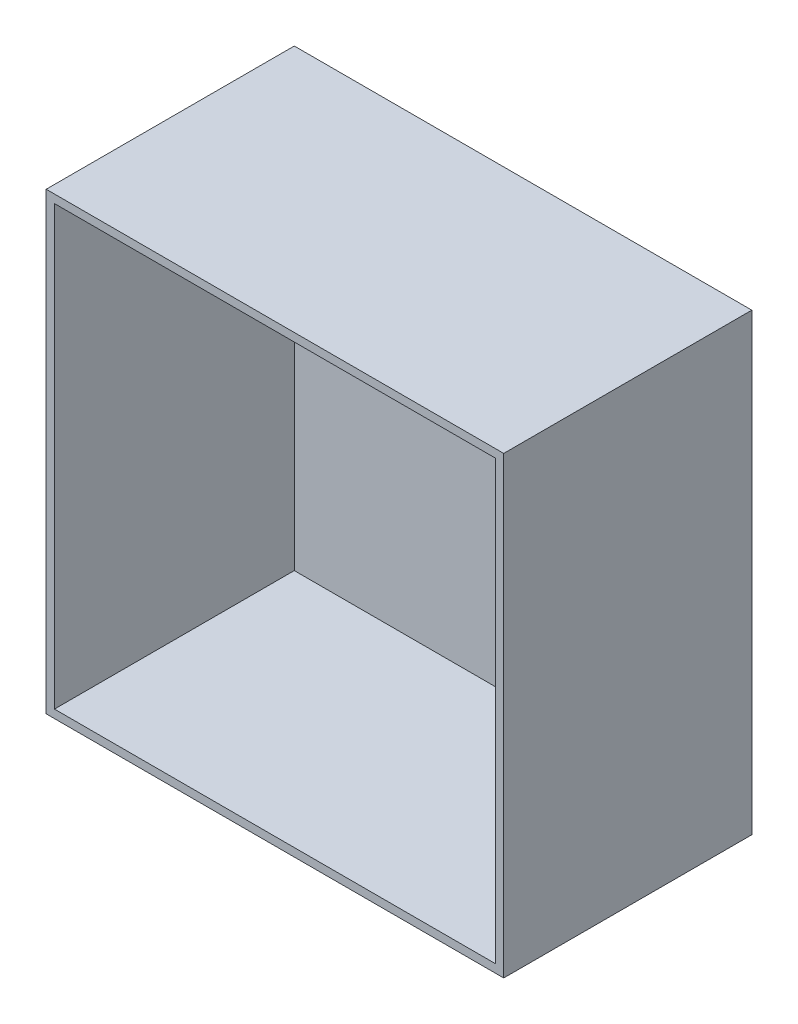
ISO-10303-21;
HEADER;
FILE_DESCRIPTION(('STEP AP214'),'2;1');
FILE_NAME('part.step','',(''),(''),'','','');
FILE_SCHEMA(('AUTOMOTIVE_DESIGN { 1 0 10303 214 1 1 1 1 }'));
ENDSEC;
DATA;
#1=APPLICATION_CONTEXT('core data for automotive mechanical design processes');
#2=APPLICATION_PROTOCOL_DEFINITION('international standard','automotive_design',2000,#1);
#3=PRODUCT_CONTEXT('',#1,'mechanical');
#4=PRODUCT('Part','Part','',(#3));
#5=PRODUCT_RELATED_PRODUCT_CATEGORY('part','',(#4));
#6=PRODUCT_DEFINITION_FORMATION('','',#4);
#7=PRODUCT_DEFINITION_CONTEXT('part definition',#1,'design');
#8=PRODUCT_DEFINITION('design','',#6,#7);
#9=PRODUCT_DEFINITION_SHAPE('','',#8);
#10=(LENGTH_UNIT() NAMED_UNIT(*) SI_UNIT(.MILLI.,.METRE.));
#11=(NAMED_UNIT(*) PLANE_ANGLE_UNIT() SI_UNIT($,.RADIAN.));
#12=(NAMED_UNIT(*) SI_UNIT($,.STERADIAN.) SOLID_ANGLE_UNIT());
#13=UNCERTAINTY_MEASURE_WITH_UNIT(LENGTH_MEASURE(1.E-05),#10,'distance_accuracy_value','');
#14=(GEOMETRIC_REPRESENTATION_CONTEXT(3) GLOBAL_UNCERTAINTY_ASSIGNED_CONTEXT((#13)) GLOBAL_UNIT_ASSIGNED_CONTEXT((#10,
#11,#12)) REPRESENTATION_CONTEXT('',''));
#15=CARTESIAN_POINT('',(0.,0.,0.));
#16=DIRECTION('',(0.,0.,1.));
#17=DIRECTION('',(1.,0.,0.));
#18=AXIS2_PLACEMENT_3D('',#15,#16,#17);
#19=CARTESIAN_POINT('',(0.,0.,60.1));
#20=DIRECTION('',(-1.,0.,0.));
#21=DIRECTION('',(0.,0.,1.));
#22=AXIS2_PLACEMENT_3D('',#19,#20,#21);
#23=PLANE('',#22);
#24=DIRECTION('',(0.,1.,0.));
#25=VECTOR('',#24,1.);
#26=CARTESIAN_POINT('',(0.,0.,0.));
#27=LINE('',#26,#25);
#28=CARTESIAN_POINT('',(0.,0.,0.));
#29=VERTEX_POINT('',#28);
#30=CARTESIAN_POINT('',(0.,110.06,0.));
#31=VERTEX_POINT('',#30);
#32=EDGE_CURVE('E141',#29,#31,#27,.T.);
#33=ORIENTED_EDGE('',*,*,#32,.T.);
#34=DIRECTION('',(0.,0.,-1.));
#35=VECTOR('',#34,1.);
#36=CARTESIAN_POINT('',(0.,110.06,60.1));
#37=LINE('',#36,#35);
#38=CARTESIAN_POINT('',(0.,110.06,60.1));
#39=VERTEX_POINT('',#38);
#40=EDGE_CURVE('E11',#39,#31,#37,.T.);
#41=ORIENTED_EDGE('',*,*,#40,.F.);
#42=DIRECTION('',(0.,1.,0.));
#43=VECTOR('',#42,1.);
#44=CARTESIAN_POINT('',(0.,0.,60.1));
#45=LINE('',#44,#43);
#46=CARTESIAN_POINT('',(0.,0.,60.1));
#47=VERTEX_POINT('',#46);
#48=EDGE_CURVE('E145',#47,#39,#45,.T.);
#49=ORIENTED_EDGE('',*,*,#48,.F.);
#50=DIRECTION('',(0.,0.,-1.));
#51=VECTOR('',#50,1.);
#52=CARTESIAN_POINT('',(0.,0.,60.1));
#53=LINE('',#52,#51);
#54=EDGE_CURVE('E151',#47,#29,#53,.T.);
#55=ORIENTED_EDGE('',*,*,#54,.T.);
#56=EDGE_LOOP('',(#33,#41,#49,#55));
#57=FACE_BOUND('',#56,.T.);
#58=ADVANCED_FACE('F33',(#57),#23,.F.);
#59=CARTESIAN_POINT('',(0.,110.06,60.1));
#60=DIRECTION('',(0.,-1.,0.));
#61=DIRECTION('',(1.,0.,0.));
#62=AXIS2_PLACEMENT_3D('',#59,#60,#61);
#63=PLANE('',#62);
#64=DIRECTION('',(-1.,0.,0.));
#65=VECTOR('',#64,1.);
#66=CARTESIAN_POINT('',(0.,110.06,0.));
#67=LINE('',#66,#65);
#68=CARTESIAN_POINT('',(-110.835,110.06,0.));
#69=VERTEX_POINT('',#68);
#70=EDGE_CURVE('E154',#31,#69,#67,.T.);
#71=ORIENTED_EDGE('',*,*,#70,.T.);
#72=DIRECTION('',(0.,0.,-1.));
#73=VECTOR('',#72,1.);
#74=CARTESIAN_POINT('',(-110.835,110.06,60.1));
#75=LINE('',#74,#73);
#76=CARTESIAN_POINT('',(-110.835,110.06,60.1));
#77=VERTEX_POINT('',#76);
#78=EDGE_CURVE('E40',#77,#69,#75,.T.);
#79=ORIENTED_EDGE('',*,*,#78,.F.);
#80=DIRECTION('',(-1.,0.,0.));
#81=VECTOR('',#80,1.);
#82=CARTESIAN_POINT('',(0.,110.06,60.1));
#83=LINE('',#82,#81);
#84=EDGE_CURVE('E84',#39,#77,#83,.T.);
#85=ORIENTED_EDGE('',*,*,#84,.F.);
#86=ORIENTED_EDGE('',*,*,#40,.T.);
#87=EDGE_LOOP('',(#71,#79,#85,#86));
#88=FACE_BOUND('',#87,.T.);
#89=ADVANCED_FACE('F183',(#88),#63,.F.);
#90=CARTESIAN_POINT('',(-110.835,0.,60.1));
#91=DIRECTION('',(1.,0.,0.));
#92=DIRECTION('',(0.,0.,-1.));
#93=AXIS2_PLACEMENT_3D('',#90,#91,#92);
#94=PLANE('',#93);
#95=DIRECTION('',(0.,-1.,0.));
#96=VECTOR('',#95,1.);
#97=CARTESIAN_POINT('',(-110.835,0.,0.));
#98=LINE('',#97,#96);
#99=CARTESIAN_POINT('',(-110.835,0.,0.));
#100=VERTEX_POINT('',#99);
#101=EDGE_CURVE('E156',#69,#100,#98,.T.);
#102=ORIENTED_EDGE('',*,*,#101,.T.);
#103=DIRECTION('',(0.,0.,-1.));
#104=VECTOR('',#103,1.);
#105=CARTESIAN_POINT('',(-110.835,0.,60.1));
#106=LINE('',#105,#104);
#107=CARTESIAN_POINT('',(-110.835,0.,60.1));
#108=VERTEX_POINT('',#107);
#109=EDGE_CURVE('E160',#108,#100,#106,.T.);
#110=ORIENTED_EDGE('',*,*,#109,.F.);
#111=DIRECTION('',(0.,-1.,0.));
#112=VECTOR('',#111,1.);
#113=CARTESIAN_POINT('',(-110.835,0.,60.1));
#114=LINE('',#113,#112);
#115=EDGE_CURVE('E148',#77,#108,#114,.T.);
#116=ORIENTED_EDGE('',*,*,#115,.F.);
#117=ORIENTED_EDGE('',*,*,#78,.T.);
#118=EDGE_LOOP('',(#102,#110,#116,#117));
#119=FACE_BOUND('',#118,.T.);
#120=ADVANCED_FACE('F165',(#119),#94,.F.);
#121=CARTESIAN_POINT('',(0.,0.,60.1));
#122=DIRECTION('',(0.,1.,0.));
#123=DIRECTION('',(-1.,0.,0.));
#124=AXIS2_PLACEMENT_3D('',#121,#122,#123);
#125=PLANE('',#124);
#126=DIRECTION('',(1.,0.,0.));
#127=VECTOR('',#126,1.);
#128=CARTESIAN_POINT('',(0.,0.,0.));
#129=LINE('',#128,#127);
#130=EDGE_CURVE('E77',#100,#29,#129,.T.);
#131=ORIENTED_EDGE('',*,*,#130,.T.);
#132=ORIENTED_EDGE('',*,*,#54,.F.);
#133=DIRECTION('',(1.,0.,0.));
#134=VECTOR('',#133,1.);
#135=CARTESIAN_POINT('',(0.,0.,60.1));
#136=LINE('',#135,#134);
#137=EDGE_CURVE('E56',#108,#47,#136,.T.);
#138=ORIENTED_EDGE('',*,*,#137,.F.);
#139=ORIENTED_EDGE('',*,*,#109,.T.);
#140=EDGE_LOOP('',(#131,#132,#138,#139));
#141=FACE_BOUND('',#140,.T.);
#142=ADVANCED_FACE('F173',(#141),#125,.F.);
#143=CARTESIAN_POINT('',(0.,0.,60.1));
#144=DIRECTION('',(0.,0.,1.));
#145=DIRECTION('',(1.,0.,0.));
#146=AXIS2_PLACEMENT_3D('',#143,#144,#145);
#147=PLANE('',#146);
#148=DIRECTION('',(0.,1.,0.));
#149=VECTOR('',#148,1.);
#150=CARTESIAN_POINT('',(-2.,1.99999999999999,60.1));
#151=LINE('',#150,#149);
#152=CARTESIAN_POINT('',(-2.,1.99999999999999,60.1));
#153=VERTEX_POINT('',#152);
#154=CARTESIAN_POINT('',(-2.,108.06,60.1));
#155=VERTEX_POINT('',#154);
#156=EDGE_CURVE('E47',#153,#155,#151,.T.);
#157=ORIENTED_EDGE('',*,*,#156,.F.);
#158=DIRECTION('',(1.,0.,0.));
#159=VECTOR('',#158,1.);
#160=CARTESIAN_POINT('',(-108.835,1.99999999999999,60.1));
#161=LINE('',#160,#159);
#162=CARTESIAN_POINT('',(-108.835,1.99999999999999,60.1));
#163=VERTEX_POINT('',#162);
#164=EDGE_CURVE('E126',#163,#153,#161,.T.);
#165=ORIENTED_EDGE('',*,*,#164,.F.);
#166=DIRECTION('',(0.,-1.,0.));
#167=VECTOR('',#166,1.);
#168=CARTESIAN_POINT('',(-108.835,1.99999999999999,60.1));
#169=LINE('',#168,#167);
#170=CARTESIAN_POINT('',(-108.835,108.06,60.1));
#171=VERTEX_POINT('',#170);
#172=EDGE_CURVE('E129',#171,#163,#169,.T.);
#173=ORIENTED_EDGE('',*,*,#172,.F.);
#174=DIRECTION('',(-1.,0.,0.));
#175=VECTOR('',#174,1.);
#176=CARTESIAN_POINT('',(-108.835,108.06,60.1));
#177=LINE('',#176,#175);
#178=EDGE_CURVE('E135',#155,#171,#177,.T.);
#179=ORIENTED_EDGE('',*,*,#178,.F.);
#180=EDGE_LOOP('',(#157,#165,#173,#179));
#181=FACE_BOUND('',#180,.T.);
#182=ORIENTED_EDGE('',*,*,#48,.T.);
#183=ORIENTED_EDGE('',*,*,#84,.T.);
#184=ORIENTED_EDGE('',*,*,#115,.T.);
#185=ORIENTED_EDGE('',*,*,#137,.T.);
#186=EDGE_LOOP('',(#182,#183,#184,#185));
#187=FACE_BOUND('',#186,.T.);
#188=ADVANCED_FACE('F175',(#181,#187),#147,.T.);
#189=CARTESIAN_POINT('',(0.,0.,0.));
#190=DIRECTION('',(0.,0.,1.));
#191=DIRECTION('',(1.,0.,0.));
#192=AXIS2_PLACEMENT_3D('',#189,#190,#191);
#193=PLANE('',#192);
#194=ORIENTED_EDGE('',*,*,#32,.F.);
#195=ORIENTED_EDGE('',*,*,#130,.F.);
#196=ORIENTED_EDGE('',*,*,#101,.F.);
#197=ORIENTED_EDGE('',*,*,#70,.F.);
#198=EDGE_LOOP('',(#194,#195,#196,#197));
#199=FACE_BOUND('',#198,.T.);
#200=ADVANCED_FACE('F169',(#199),#193,.F.);
#201=CARTESIAN_POINT('',(-2.,1.99999999999999,2.));
#202=DIRECTION('',(1.,0.,0.));
#203=DIRECTION('',(0.,0.,-1.));
#204=AXIS2_PLACEMENT_3D('',#201,#202,#203);
#205=PLANE('',#204);
#206=ORIENTED_EDGE('',*,*,#156,.T.);
#207=DIRECTION('',(0.,0.,1.));
#208=VECTOR('',#207,1.);
#209=CARTESIAN_POINT('',(-2.,108.06,2.));
#210=LINE('',#209,#208);
#211=CARTESIAN_POINT('',(-2.,108.06,2.));
#212=VERTEX_POINT('',#211);
#213=EDGE_CURVE('E104',#212,#155,#210,.T.);
#214=ORIENTED_EDGE('',*,*,#213,.F.);
#215=DIRECTION('',(0.,1.,0.));
#216=VECTOR('',#215,1.);
#217=CARTESIAN_POINT('',(-2.,1.99999999999999,2.));
#218=LINE('',#217,#216);
#219=CARTESIAN_POINT('',(-2.,1.99999999999999,2.));
#220=VERTEX_POINT('',#219);
#221=EDGE_CURVE('E108',#220,#212,#218,.T.);
#222=ORIENTED_EDGE('',*,*,#221,.F.);
#223=DIRECTION('',(0.,0.,1.));
#224=VECTOR('',#223,1.);
#225=CARTESIAN_POINT('',(-2.,1.99999999999999,2.));
#226=LINE('',#225,#224);
#227=EDGE_CURVE('E139',#220,#153,#226,.T.);
#228=ORIENTED_EDGE('',*,*,#227,.T.);
#229=EDGE_LOOP('',(#206,#214,#222,#228));
#230=FACE_BOUND('',#229,.T.);
#231=ADVANCED_FACE('F106',(#230),#205,.F.);
#232=CARTESIAN_POINT('',(-108.835,1.99999999999999,2.));
#233=DIRECTION('',(0.,-1.,0.));
#234=DIRECTION('',(0.,0.,-1.));
#235=AXIS2_PLACEMENT_3D('',#232,#233,#234);
#236=PLANE('',#235);
#237=ORIENTED_EDGE('',*,*,#164,.T.);
#238=ORIENTED_EDGE('',*,*,#227,.F.);
#239=DIRECTION('',(1.,0.,0.));
#240=VECTOR('',#239,1.);
#241=CARTESIAN_POINT('',(-108.835,1.99999999999999,2.));
#242=LINE('',#241,#240);
#243=CARTESIAN_POINT('',(-108.835,1.99999999999999,2.));
#244=VERTEX_POINT('',#243);
#245=EDGE_CURVE('E114',#244,#220,#242,.T.);
#246=ORIENTED_EDGE('',*,*,#245,.F.);
#247=DIRECTION('',(0.,0.,1.));
#248=VECTOR('',#247,1.);
#249=CARTESIAN_POINT('',(-108.835,1.99999999999999,2.));
#250=LINE('',#249,#248);
#251=EDGE_CURVE('E142',#244,#163,#250,.T.);
#252=ORIENTED_EDGE('',*,*,#251,.T.);
#253=EDGE_LOOP('',(#237,#238,#246,#252));
#254=FACE_BOUND('',#253,.T.);
#255=ADVANCED_FACE('F222',(#254),#236,.F.);
#256=CARTESIAN_POINT('',(-108.835,1.99999999999999,2.));
#257=DIRECTION('',(-1.,0.,0.));
#258=DIRECTION('',(0.,0.,1.));
#259=AXIS2_PLACEMENT_3D('',#256,#257,#258);
#260=PLANE('',#259);
#261=ORIENTED_EDGE('',*,*,#172,.T.);
#262=ORIENTED_EDGE('',*,*,#251,.F.);
#263=DIRECTION('',(0.,-1.,0.));
#264=VECTOR('',#263,1.);
#265=CARTESIAN_POINT('',(-108.835,1.99999999999999,2.));
#266=LINE('',#265,#264);
#267=CARTESIAN_POINT('',(-108.835,108.06,2.));
#268=VERTEX_POINT('',#267);
#269=EDGE_CURVE('E122',#268,#244,#266,.T.);
#270=ORIENTED_EDGE('',*,*,#269,.F.);
#271=DIRECTION('',(0.,0.,1.));
#272=VECTOR('',#271,1.);
#273=CARTESIAN_POINT('',(-108.835,108.06,2.));
#274=LINE('',#273,#272);
#275=EDGE_CURVE('E113',#268,#171,#274,.T.);
#276=ORIENTED_EDGE('',*,*,#275,.T.);
#277=EDGE_LOOP('',(#261,#262,#270,#276));
#278=FACE_BOUND('',#277,.T.);
#279=ADVANCED_FACE('F231',(#278),#260,.F.);
#280=CARTESIAN_POINT('',(-108.835,108.06,2.));
#281=DIRECTION('',(0.,1.,0.));
#282=DIRECTION('',(0.,0.,1.));
#283=AXIS2_PLACEMENT_3D('',#280,#281,#282);
#284=PLANE('',#283);
#285=ORIENTED_EDGE('',*,*,#178,.T.);
#286=ORIENTED_EDGE('',*,*,#275,.F.);
#287=DIRECTION('',(-1.,0.,0.));
#288=VECTOR('',#287,1.);
#289=CARTESIAN_POINT('',(-108.835,108.06,2.));
#290=LINE('',#289,#288);
#291=EDGE_CURVE('E117',#212,#268,#290,.T.);
#292=ORIENTED_EDGE('',*,*,#291,.F.);
#293=ORIENTED_EDGE('',*,*,#213,.T.);
#294=EDGE_LOOP('',(#285,#286,#292,#293));
#295=FACE_BOUND('',#294,.T.);
#296=ADVANCED_FACE('F118',(#295),#284,.F.);
#297=CARTESIAN_POINT('',(0.,0.,2.));
#298=DIRECTION('',(0.,0.,-1.));
#299=DIRECTION('',(-1.,0.,0.));
#300=AXIS2_PLACEMENT_3D('',#297,#298,#299);
#301=PLANE('',#300);
#302=ORIENTED_EDGE('',*,*,#221,.T.);
#303=ORIENTED_EDGE('',*,*,#291,.T.);
#304=ORIENTED_EDGE('',*,*,#269,.T.);
#305=ORIENTED_EDGE('',*,*,#245,.T.);
#306=EDGE_LOOP('',(#302,#303,#304,#305));
#307=FACE_BOUND('',#306,.T.);
#308=ADVANCED_FACE('F124',(#307),#301,.F.);
#309=CLOSED_SHELL('',(#58,#89,#120,#142,#188,#200,#231,#255,#279,#296,#308));
#310=MANIFOLD_SOLID_BREP('B2',#309);
#311=ADVANCED_BREP_SHAPE_REPRESENTATION('',(#18,#310),#14);
#312=SHAPE_DEFINITION_REPRESENTATION(#9,#311);
ENDSEC;
END-ISO-10303-21;
